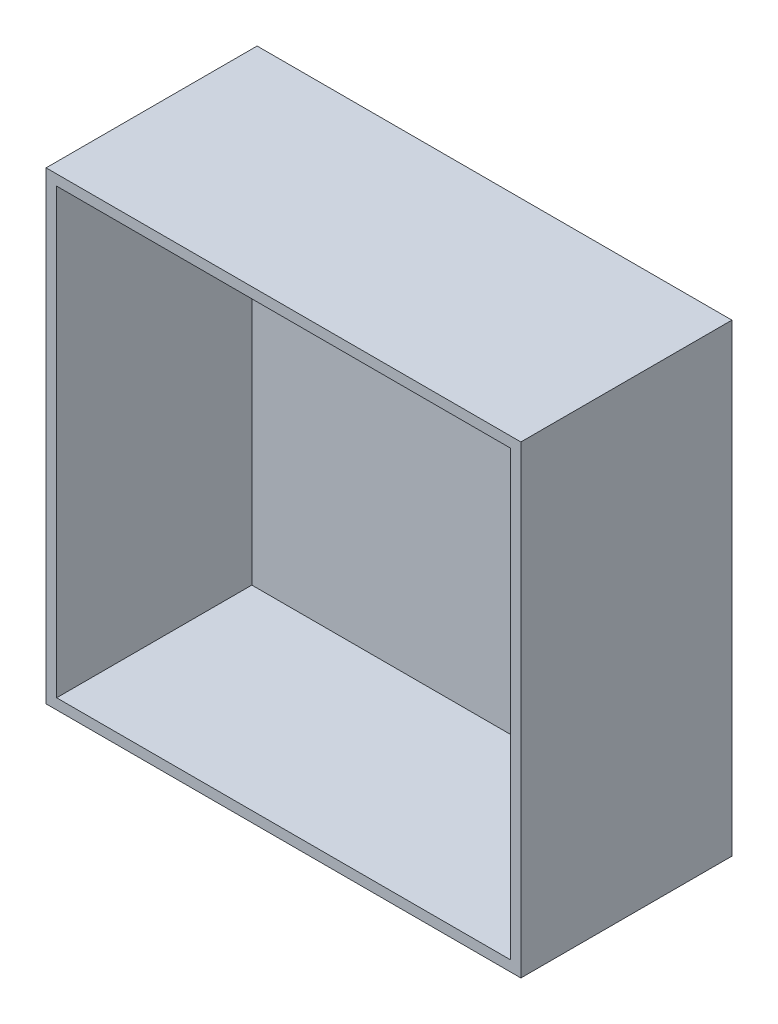
ISO-10303-21;
HEADER;
FILE_DESCRIPTION(('STEP AP214'),'2;1');
FILE_NAME('part.step','',(''),(''),'','','');
FILE_SCHEMA(('AUTOMOTIVE_DESIGN { 1 0 10303 214 1 1 1 1 }'));
ENDSEC;
DATA;
#1=APPLICATION_CONTEXT('core data for automotive mechanical design processes');
#2=APPLICATION_PROTOCOL_DEFINITION('international standard','automotive_design',2000,#1);
#3=PRODUCT_CONTEXT('',#1,'mechanical');
#4=PRODUCT('Part','Part','',(#3));
#5=PRODUCT_RELATED_PRODUCT_CATEGORY('part','',(#4));
#6=PRODUCT_DEFINITION_FORMATION('','',#4);
#7=PRODUCT_DEFINITION_CONTEXT('part definition',#1,'design');
#8=PRODUCT_DEFINITION('design','',#6,#7);
#9=PRODUCT_DEFINITION_SHAPE('','',#8);
#10=(LENGTH_UNIT() NAMED_UNIT(*) SI_UNIT(.MILLI.,.METRE.));
#11=(NAMED_UNIT(*) PLANE_ANGLE_UNIT() SI_UNIT($,.RADIAN.));
#12=(NAMED_UNIT(*) SI_UNIT($,.STERADIAN.) SOLID_ANGLE_UNIT());
#13=UNCERTAINTY_MEASURE_WITH_UNIT(LENGTH_MEASURE(1.E-05),#10,'distance_accuracy_value','');
#14=(GEOMETRIC_REPRESENTATION_CONTEXT(3) GLOBAL_UNCERTAINTY_ASSIGNED_CONTEXT((#13)) GLOBAL_UNIT_ASSIGNED_CONTEXT((#10,
#11,#12)) REPRESENTATION_CONTEXT('',''));
#15=CARTESIAN_POINT('',(0.,0.,0.));
#16=DIRECTION('',(0.,0.,1.));
#17=DIRECTION('',(1.,0.,0.));
#18=AXIS2_PLACEMENT_3D('',#15,#16,#17);
#19=CARTESIAN_POINT('',(0.,0.,40.));
#20=DIRECTION('',(0.,0.,-1.));
#21=DIRECTION('',(-1.,0.,0.));
#22=AXIS2_PLACEMENT_3D('',#19,#20,#21);
#23=PLANE('',#22);
#24=DIRECTION('',(0.,-1.,0.));
#25=VECTOR('',#24,1.);
#26=CARTESIAN_POINT('',(120.,-44.,40.));
#27=LINE('',#26,#25);
#28=CARTESIAN_POINT('',(120.,44.,40.));
#29=VERTEX_POINT('',#28);
#30=CARTESIAN_POINT('',(120.,-44.,40.));
#31=VERTEX_POINT('',#30);
#32=EDGE_CURVE('E153',#29,#31,#27,.T.);
#33=ORIENTED_EDGE('',*,*,#32,.T.);
#34=DIRECTION('',(1.,0.,0.));
#35=VECTOR('',#34,1.);
#36=CARTESIAN_POINT('',(120.,-44.,40.));
#37=LINE('',#36,#35);
#38=CARTESIAN_POINT('',(210.,-44.,40.));
#39=VERTEX_POINT('',#38);
#40=EDGE_CURVE('E93',#31,#39,#37,.T.);
#41=ORIENTED_EDGE('',*,*,#40,.T.);
#42=DIRECTION('',(0.,1.,0.));
#43=VECTOR('',#42,1.);
#44=CARTESIAN_POINT('',(210.,-44.,40.));
#45=LINE('',#44,#43);
#46=CARTESIAN_POINT('',(210.,44.,40.));
#47=VERTEX_POINT('',#46);
#48=EDGE_CURVE('E156',#39,#47,#45,.T.);
#49=ORIENTED_EDGE('',*,*,#48,.T.);
#50=DIRECTION('',(-1.,0.,0.));
#51=VECTOR('',#50,1.);
#52=CARTESIAN_POINT('',(120.,44.,40.));
#53=LINE('',#52,#51);
#54=EDGE_CURVE('E62',#47,#29,#53,.T.);
#55=ORIENTED_EDGE('',*,*,#54,.T.);
#56=EDGE_LOOP('',(#33,#41,#49,#55));
#57=FACE_BOUND('',#56,.T.);
#58=DIRECTION('',(0.,-1.,0.));
#59=VECTOR('',#58,1.);
#60=CARTESIAN_POINT('',(122.,-42.,40.));
#61=LINE('',#60,#59);
#62=CARTESIAN_POINT('',(122.,42.,40.));
#63=VERTEX_POINT('',#62);
#64=CARTESIAN_POINT('',(122.,-42.,40.));
#65=VERTEX_POINT('',#64);
#66=EDGE_CURVE('E113',#63,#65,#61,.T.);
#67=ORIENTED_EDGE('',*,*,#66,.F.);
#68=DIRECTION('',(-1.,0.,0.));
#69=VECTOR('',#68,1.);
#70=CARTESIAN_POINT('',(122.,42.,40.));
#71=LINE('',#70,#69);
#72=CARTESIAN_POINT('',(208.,42.,40.));
#73=VERTEX_POINT('',#72);
#74=EDGE_CURVE('E139',#73,#63,#71,.T.);
#75=ORIENTED_EDGE('',*,*,#74,.F.);
#76=DIRECTION('',(0.,1.,0.));
#77=VECTOR('',#76,1.);
#78=CARTESIAN_POINT('',(208.,-42.,40.));
#79=LINE('',#78,#77);
#80=CARTESIAN_POINT('',(208.,-42.,40.));
#81=VERTEX_POINT('',#80);
#82=EDGE_CURVE('E138',#81,#73,#79,.T.);
#83=ORIENTED_EDGE('',*,*,#82,.F.);
#84=DIRECTION('',(1.,0.,0.));
#85=VECTOR('',#84,1.);
#86=CARTESIAN_POINT('',(122.,-42.,40.));
#87=LINE('',#86,#85);
#88=EDGE_CURVE('E127',#65,#81,#87,.T.);
#89=ORIENTED_EDGE('',*,*,#88,.F.);
#90=EDGE_LOOP('',(#67,#75,#83,#89));
#91=FACE_BOUND('',#90,.T.);
#92=ADVANCED_FACE('F39',(#57,#91),#23,.F.);
#93=CARTESIAN_POINT('',(120.,-44.,40.));
#94=DIRECTION('',(1.,0.,0.));
#95=DIRECTION('',(0.,0.,-1.));
#96=AXIS2_PLACEMENT_3D('',#93,#94,#95);
#97=PLANE('',#96);
#98=DIRECTION('',(0.,-1.,0.));
#99=VECTOR('',#98,1.);
#100=CARTESIAN_POINT('',(120.,-44.,0.));
#101=LINE('',#100,#99);
#102=CARTESIAN_POINT('',(120.,44.,0.));
#103=VERTEX_POINT('',#102);
#104=CARTESIAN_POINT('',(120.,-44.,0.));
#105=VERTEX_POINT('',#104);
#106=EDGE_CURVE('E135',#103,#105,#101,.T.);
#107=ORIENTED_EDGE('',*,*,#106,.T.);
#108=DIRECTION('',(0.,0.,-1.));
#109=VECTOR('',#108,1.);
#110=CARTESIAN_POINT('',(120.,-44.,40.));
#111=LINE('',#110,#109);
#112=EDGE_CURVE('E11',#31,#105,#111,.T.);
#113=ORIENTED_EDGE('',*,*,#112,.F.);
#114=ORIENTED_EDGE('',*,*,#32,.F.);
#115=DIRECTION('',(0.,0.,-1.));
#116=VECTOR('',#115,1.);
#117=CARTESIAN_POINT('',(120.,44.,40.));
#118=LINE('',#117,#116);
#119=EDGE_CURVE('E157',#29,#103,#118,.T.);
#120=ORIENTED_EDGE('',*,*,#119,.T.);
#121=EDGE_LOOP('',(#107,#113,#114,#120));
#122=FACE_BOUND('',#121,.T.);
#123=ADVANCED_FACE('F41',(#122),#97,.F.);
#124=CARTESIAN_POINT('',(120.,-44.,40.));
#125=DIRECTION('',(0.,1.,0.));
#126=DIRECTION('',(0.,0.,1.));
#127=AXIS2_PLACEMENT_3D('',#124,#125,#126);
#128=PLANE('',#127);
#129=DIRECTION('',(1.,0.,0.));
#130=VECTOR('',#129,1.);
#131=CARTESIAN_POINT('',(120.,-44.,0.));
#132=LINE('',#131,#130);
#133=CARTESIAN_POINT('',(210.,-44.,0.));
#134=VERTEX_POINT('',#133);
#135=EDGE_CURVE('E165',#105,#134,#132,.T.);
#136=ORIENTED_EDGE('',*,*,#135,.T.);
#137=DIRECTION('',(0.,0.,-1.));
#138=VECTOR('',#137,1.);
#139=CARTESIAN_POINT('',(210.,-44.,40.));
#140=LINE('',#139,#138);
#141=EDGE_CURVE('E50',#39,#134,#140,.T.);
#142=ORIENTED_EDGE('',*,*,#141,.F.);
#143=ORIENTED_EDGE('',*,*,#40,.F.);
#144=ORIENTED_EDGE('',*,*,#112,.T.);
#145=EDGE_LOOP('',(#136,#142,#143,#144));
#146=FACE_BOUND('',#145,.T.);
#147=ADVANCED_FACE('F190',(#146),#128,.F.);
#148=CARTESIAN_POINT('',(210.,-44.,40.));
#149=DIRECTION('',(-1.,0.,0.));
#150=DIRECTION('',(0.,0.,1.));
#151=AXIS2_PLACEMENT_3D('',#148,#149,#150);
#152=PLANE('',#151);
#153=DIRECTION('',(0.,1.,0.));
#154=VECTOR('',#153,1.);
#155=CARTESIAN_POINT('',(210.,-44.,0.));
#156=LINE('',#155,#154);
#157=CARTESIAN_POINT('',(210.,44.,0.));
#158=VERTEX_POINT('',#157);
#159=EDGE_CURVE('E163',#134,#158,#156,.T.);
#160=ORIENTED_EDGE('',*,*,#159,.T.);
#161=DIRECTION('',(0.,0.,-1.));
#162=VECTOR('',#161,1.);
#163=CARTESIAN_POINT('',(210.,44.,40.));
#164=LINE('',#163,#162);
#165=EDGE_CURVE('E169',#47,#158,#164,.T.);
#166=ORIENTED_EDGE('',*,*,#165,.F.);
#167=ORIENTED_EDGE('',*,*,#48,.F.);
#168=ORIENTED_EDGE('',*,*,#141,.T.);
#169=EDGE_LOOP('',(#160,#166,#167,#168));
#170=FACE_BOUND('',#169,.T.);
#171=ADVANCED_FACE('F172',(#170),#152,.F.);
#172=CARTESIAN_POINT('',(120.,44.,40.));
#173=DIRECTION('',(0.,-1.,0.));
#174=DIRECTION('',(0.,0.,-1.));
#175=AXIS2_PLACEMENT_3D('',#172,#173,#174);
#176=PLANE('',#175);
#177=DIRECTION('',(-1.,0.,0.));
#178=VECTOR('',#177,1.);
#179=CARTESIAN_POINT('',(120.,44.,0.));
#180=LINE('',#179,#178);
#181=EDGE_CURVE('E82',#158,#103,#180,.T.);
#182=ORIENTED_EDGE('',*,*,#181,.T.);
#183=ORIENTED_EDGE('',*,*,#119,.F.);
#184=ORIENTED_EDGE('',*,*,#54,.F.);
#185=ORIENTED_EDGE('',*,*,#165,.T.);
#186=EDGE_LOOP('',(#182,#183,#184,#185));
#187=FACE_BOUND('',#186,.T.);
#188=ADVANCED_FACE('F182',(#187),#176,.F.);
#189=CARTESIAN_POINT('',(0.,0.,0.));
#190=DIRECTION('',(0.,0.,-1.));
#191=DIRECTION('',(-1.,0.,0.));
#192=AXIS2_PLACEMENT_3D('',#189,#190,#191);
#193=PLANE('',#192);
#194=ORIENTED_EDGE('',*,*,#106,.F.);
#195=ORIENTED_EDGE('',*,*,#181,.F.);
#196=ORIENTED_EDGE('',*,*,#159,.F.);
#197=ORIENTED_EDGE('',*,*,#135,.F.);
#198=EDGE_LOOP('',(#194,#195,#196,#197));
#199=FACE_BOUND('',#198,.T.);
#200=ADVANCED_FACE('F180',(#199),#193,.T.);
#201=CARTESIAN_POINT('',(122.,-42.,40.));
#202=DIRECTION('',(1.,0.,0.));
#203=DIRECTION('',(0.,0.,-1.));
#204=AXIS2_PLACEMENT_3D('',#201,#202,#203);
#205=PLANE('',#204);
#206=DIRECTION('',(0.,-1.,0.));
#207=VECTOR('',#206,1.);
#208=CARTESIAN_POINT('',(122.,-42.,3.));
#209=LINE('',#208,#207);
#210=CARTESIAN_POINT('',(122.,42.,3.));
#211=VERTEX_POINT('',#210);
#212=CARTESIAN_POINT('',(122.,-42.,3.));
#213=VERTEX_POINT('',#212);
#214=EDGE_CURVE('E145',#211,#213,#209,.T.);
#215=ORIENTED_EDGE('',*,*,#214,.F.);
#216=DIRECTION('',(0.,0.,-1.));
#217=VECTOR('',#216,1.);
#218=CARTESIAN_POINT('',(122.,42.,40.));
#219=LINE('',#218,#217);
#220=EDGE_CURVE('E125',#63,#211,#219,.T.);
#221=ORIENTED_EDGE('',*,*,#220,.F.);
#222=ORIENTED_EDGE('',*,*,#66,.T.);
#223=DIRECTION('',(0.,0.,-1.));
#224=VECTOR('',#223,1.);
#225=CARTESIAN_POINT('',(122.,-42.,40.));
#226=LINE('',#225,#224);
#227=EDGE_CURVE('E120',#65,#213,#226,.T.);
#228=ORIENTED_EDGE('',*,*,#227,.T.);
#229=EDGE_LOOP('',(#215,#221,#222,#228));
#230=FACE_BOUND('',#229,.T.);
#231=ADVANCED_FACE('F117',(#230),#205,.T.);
#232=CARTESIAN_POINT('',(122.,-42.,40.));
#233=DIRECTION('',(0.,1.,0.));
#234=DIRECTION('',(0.,0.,1.));
#235=AXIS2_PLACEMENT_3D('',#232,#233,#234);
#236=PLANE('',#235);
#237=DIRECTION('',(1.,0.,0.));
#238=VECTOR('',#237,1.);
#239=CARTESIAN_POINT('',(122.,-42.,3.));
#240=LINE('',#239,#238);
#241=CARTESIAN_POINT('',(208.,-42.,3.));
#242=VERTEX_POINT('',#241);
#243=EDGE_CURVE('E132',#213,#242,#240,.T.);
#244=ORIENTED_EDGE('',*,*,#243,.F.);
#245=ORIENTED_EDGE('',*,*,#227,.F.);
#246=ORIENTED_EDGE('',*,*,#88,.T.);
#247=DIRECTION('',(0.,0.,-1.));
#248=VECTOR('',#247,1.);
#249=CARTESIAN_POINT('',(208.,-42.,40.));
#250=LINE('',#249,#248);
#251=EDGE_CURVE('E131',#81,#242,#250,.T.);
#252=ORIENTED_EDGE('',*,*,#251,.T.);
#253=EDGE_LOOP('',(#244,#245,#246,#252));
#254=FACE_BOUND('',#253,.T.);
#255=ADVANCED_FACE('F128',(#254),#236,.T.);
#256=CARTESIAN_POINT('',(208.,-42.,40.));
#257=DIRECTION('',(-1.,0.,0.));
#258=DIRECTION('',(0.,0.,1.));
#259=AXIS2_PLACEMENT_3D('',#256,#257,#258);
#260=PLANE('',#259);
#261=DIRECTION('',(0.,1.,0.));
#262=VECTOR('',#261,1.);
#263=CARTESIAN_POINT('',(208.,-42.,3.));
#264=LINE('',#263,#262);
#265=CARTESIAN_POINT('',(208.,42.,3.));
#266=VERTEX_POINT('',#265);
#267=EDGE_CURVE('E150',#242,#266,#264,.T.);
#268=ORIENTED_EDGE('',*,*,#267,.F.);
#269=ORIENTED_EDGE('',*,*,#251,.F.);
#270=ORIENTED_EDGE('',*,*,#82,.T.);
#271=DIRECTION('',(0.,0.,-1.));
#272=VECTOR('',#271,1.);
#273=CARTESIAN_POINT('',(208.,42.,40.));
#274=LINE('',#273,#272);
#275=EDGE_CURVE('E53',#73,#266,#274,.T.);
#276=ORIENTED_EDGE('',*,*,#275,.T.);
#277=EDGE_LOOP('',(#268,#269,#270,#276));
#278=FACE_BOUND('',#277,.T.);
#279=ADVANCED_FACE('F203',(#278),#260,.T.);
#280=CARTESIAN_POINT('',(122.,42.,40.));
#281=DIRECTION('',(0.,-1.,0.));
#282=DIRECTION('',(0.,0.,-1.));
#283=AXIS2_PLACEMENT_3D('',#280,#281,#282);
#284=PLANE('',#283);
#285=DIRECTION('',(-1.,0.,0.));
#286=VECTOR('',#285,1.);
#287=CARTESIAN_POINT('',(122.,42.,3.));
#288=LINE('',#287,#286);
#289=EDGE_CURVE('E130',#266,#211,#288,.T.);
#290=ORIENTED_EDGE('',*,*,#289,.F.);
#291=ORIENTED_EDGE('',*,*,#275,.F.);
#292=ORIENTED_EDGE('',*,*,#74,.T.);
#293=ORIENTED_EDGE('',*,*,#220,.T.);
#294=EDGE_LOOP('',(#290,#291,#292,#293));
#295=FACE_BOUND('',#294,.T.);
#296=ADVANCED_FACE('F204',(#295),#284,.T.);
#297=CARTESIAN_POINT('',(0.,0.,3.));
#298=DIRECTION('',(0.,0.,-1.));
#299=DIRECTION('',(-1.,0.,0.));
#300=AXIS2_PLACEMENT_3D('',#297,#298,#299);
#301=PLANE('',#300);
#302=ORIENTED_EDGE('',*,*,#214,.T.);
#303=ORIENTED_EDGE('',*,*,#243,.T.);
#304=ORIENTED_EDGE('',*,*,#267,.T.);
#305=ORIENTED_EDGE('',*,*,#289,.T.);
#306=EDGE_LOOP('',(#302,#303,#304,#305));
#307=FACE_BOUND('',#306,.T.);
#308=ADVANCED_FACE('F208',(#307),#301,.F.);
#309=CLOSED_SHELL('',(#92,#123,#147,#171,#188,#200,#231,#255,#279,#296,#308));
#310=MANIFOLD_SOLID_BREP('B2',#309);
#311=ADVANCED_BREP_SHAPE_REPRESENTATION('',(#18,#310),#14);
#312=SHAPE_DEFINITION_REPRESENTATION(#9,#311);
ENDSEC;
END-ISO-10303-21;
